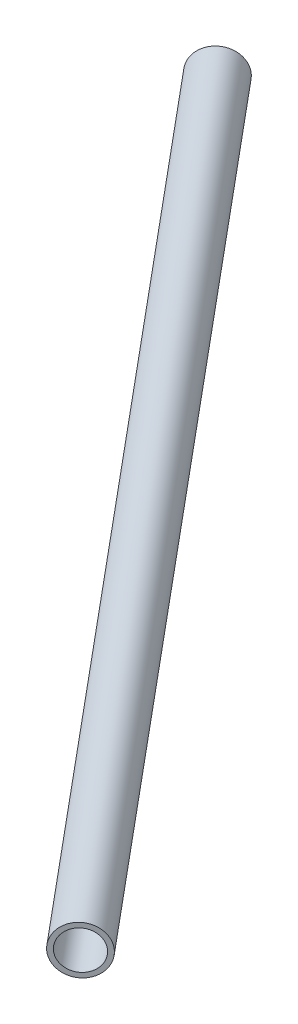
ISO-10303-21;
HEADER;
FILE_DESCRIPTION(('STEP AP214'),'2;1');
FILE_NAME('part.step','',(''),(''),'','','');
FILE_SCHEMA(('AUTOMOTIVE_DESIGN { 1 0 10303 214 1 1 1 1 }'));
ENDSEC;
DATA;
#1=APPLICATION_CONTEXT('core data for automotive mechanical design processes');
#2=APPLICATION_PROTOCOL_DEFINITION('international standard','automotive_design',2000,#1);
#3=PRODUCT_CONTEXT('',#1,'mechanical');
#4=PRODUCT('Part','Part','',(#3));
#5=PRODUCT_RELATED_PRODUCT_CATEGORY('part','',(#4));
#6=PRODUCT_DEFINITION_FORMATION('','',#4);
#7=PRODUCT_DEFINITION_CONTEXT('part definition',#1,'design');
#8=PRODUCT_DEFINITION('design','',#6,#7);
#9=PRODUCT_DEFINITION_SHAPE('','',#8);
#10=(LENGTH_UNIT() NAMED_UNIT(*) SI_UNIT(.MILLI.,.METRE.));
#11=(NAMED_UNIT(*) PLANE_ANGLE_UNIT() SI_UNIT($,.RADIAN.));
#12=(NAMED_UNIT(*) SI_UNIT($,.STERADIAN.) SOLID_ANGLE_UNIT());
#13=UNCERTAINTY_MEASURE_WITH_UNIT(LENGTH_MEASURE(1.E-05),#10,'distance_accuracy_value','');
#14=(GEOMETRIC_REPRESENTATION_CONTEXT(3) GLOBAL_UNCERTAINTY_ASSIGNED_CONTEXT((#13)) GLOBAL_UNIT_ASSIGNED_CONTEXT((#10,
#11,#12)) REPRESENTATION_CONTEXT('',''));
#15=CARTESIAN_POINT('',(0.,0.,0.));
#16=DIRECTION('',(0.,0.,1.));
#17=DIRECTION('',(1.,0.,0.));
#18=AXIS2_PLACEMENT_3D('',#15,#16,#17);
#19=CARTESIAN_POINT('',(128.459886797962,0.,-309.266363492759));
#20=DIRECTION('',(0.640710401664878,0.,0.767782639292157));
#21=DIRECTION('',(0.767782639292157,0.,-0.640710401664878));
#22=AXIS2_PLACEMENT_3D('',#19,#20,#21);
#23=PLANE('',#22);
#24=CARTESIAN_POINT('',(128.459886797961,0.,-309.266363492757));
#25=DIRECTION('',(0.640710401664878,0.,0.767782639292157));
#26=DIRECTION('',(0.767782639292157,0.,-0.640710401664878));
#27=AXIS2_PLACEMENT_3D('',#24,#25,#26);
#28=CIRCLE('',#27,4.00000000000001);
#29=CARTESIAN_POINT('',(131.531017355129,0.,-311.829205099417));
#30=VERTEX_POINT('',#29);
#31=EDGE_CURVE('E70',#30,#30,#28,.F.);
#32=ORIENTED_EDGE('',*,*,#31,.F.);
#33=EDGE_LOOP('',(#32));
#34=FACE_BOUND('',#33,.T.);
#35=CARTESIAN_POINT('',(128.459886797962,0.,-309.266363492759));
#36=DIRECTION('',(0.640710401664878,0.,0.767782639292157));
#37=DIRECTION('',(0.767782639292157,0.,-0.640710401664878));
#38=AXIS2_PLACEMENT_3D('',#35,#36,#37);
#39=CIRCLE('',#38,5.00000000000001);
#40=CARTESIAN_POINT('',(132.298799994423,0.,-312.469915501083));
#41=VERTEX_POINT('',#40);
#42=EDGE_CURVE('E60',#41,#41,#39,.T.);
#43=ORIENTED_EDGE('',*,*,#42,.F.);
#44=EDGE_LOOP('',(#43));
#45=FACE_BOUND('',#44,.T.);
#46=ADVANCED_FACE('F53',(#34,#45),#23,.F.);
#47=CARTESIAN_POINT('',(271.805005174328,0.,-137.491575646848));
#48=DIRECTION('',(0.640710401664878,0.,0.767782639292157));
#49=DIRECTION('',(0.767782639292157,0.,-0.640710401664878));
#50=AXIS2_PLACEMENT_3D('',#47,#48,#49);
#51=PLANE('',#50);
#52=CARTESIAN_POINT('',(271.805005174326,0.,-137.491575646846));
#53=DIRECTION('',(0.640710401664878,0.,0.767782639292157));
#54=DIRECTION('',(0.767782639292157,0.,-0.640710401664878));
#55=AXIS2_PLACEMENT_3D('',#52,#53,#54);
#56=CIRCLE('',#55,4.00000000000001);
#57=CARTESIAN_POINT('',(274.876135731495,0.,-140.054417253506));
#58=VERTEX_POINT('',#57);
#59=EDGE_CURVE('E65',#58,#58,#56,.F.);
#60=ORIENTED_EDGE('',*,*,#59,.T.);
#61=EDGE_LOOP('',(#60));
#62=FACE_BOUND('',#61,.T.);
#63=CARTESIAN_POINT('',(271.805005174328,0.,-137.491575646848));
#64=DIRECTION('',(0.640710401664878,0.,0.767782639292157));
#65=DIRECTION('',(0.767782639292157,0.,-0.640710401664878));
#66=AXIS2_PLACEMENT_3D('',#63,#64,#65);
#67=CIRCLE('',#66,5.00000000000001);
#68=CARTESIAN_POINT('',(275.643918370789,0.,-140.695127655172));
#69=VERTEX_POINT('',#68);
#70=EDGE_CURVE('E11',#69,#69,#67,.T.);
#71=ORIENTED_EDGE('',*,*,#70,.T.);
#72=EDGE_LOOP('',(#71));
#73=FACE_BOUND('',#72,.T.);
#74=ADVANCED_FACE('F82',(#62,#73),#51,.T.);
#75=CARTESIAN_POINT('',(128.459886797962,0.,-309.266363492759));
#76=DIRECTION('',(0.640710401664878,0.,0.767782639292157));
#77=DIRECTION('',(0.767782639292157,0.,-0.640710401664878));
#78=AXIS2_PLACEMENT_3D('',#75,#76,#77);
#79=CYLINDRICAL_SURFACE('',#78,5.00000000000001);
#80=ORIENTED_EDGE('',*,*,#70,.F.);
#81=EDGE_LOOP('',(#80));
#82=FACE_BOUND('',#81,.T.);
#83=ORIENTED_EDGE('',*,*,#42,.T.);
#84=EDGE_LOOP('',(#83));
#85=FACE_BOUND('',#84,.T.);
#86=ADVANCED_FACE('F86',(#82,#85),#79,.T.);
#87=CARTESIAN_POINT('',(125.256334789695,0.,-313.105276689148));
#88=DIRECTION('',(0.640710401664878,0.,0.767782639292157));
#89=DIRECTION('',(0.767782639292157,0.,-0.640710401664878));
#90=AXIS2_PLACEMENT_3D('',#87,#88,#89);
#91=CYLINDRICAL_SURFACE('',#90,4.00000000000001);
#92=ORIENTED_EDGE('',*,*,#31,.T.);
#93=EDGE_LOOP('',(#92));
#94=FACE_BOUND('',#93,.T.);
#95=ORIENTED_EDGE('',*,*,#59,.F.);
#96=EDGE_LOOP('',(#95));
#97=FACE_BOUND('',#96,.T.);
#98=ADVANCED_FACE('F77',(#94,#97),#91,.F.);
#99=CLOSED_SHELL('',(#46,#74,#86,#98));
#100=MANIFOLD_SOLID_BREP('B2',#99);
#101=ADVANCED_BREP_SHAPE_REPRESENTATION('',(#18,#100),#14);
#102=SHAPE_DEFINITION_REPRESENTATION(#9,#101);
ENDSEC;
END-ISO-10303-21;
